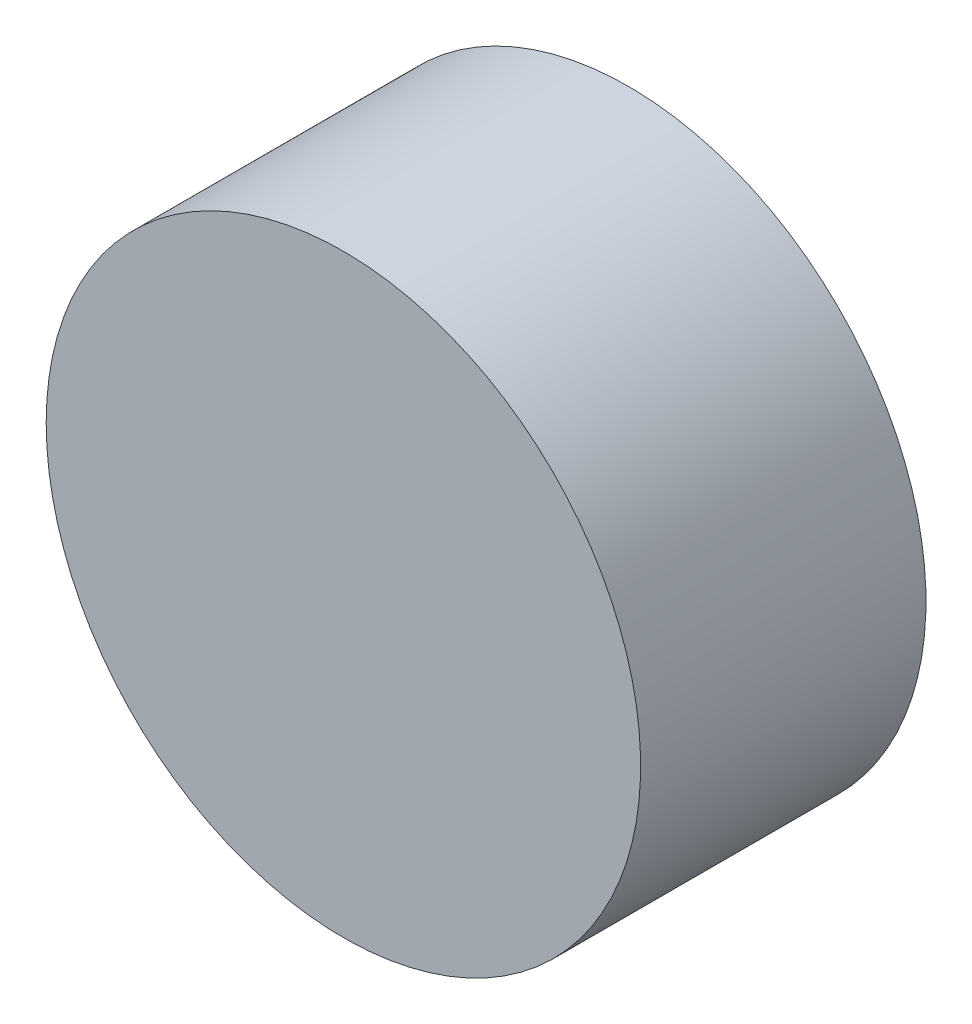
ISO-10303-21;
HEADER;
FILE_DESCRIPTION(('STEP AP214'),'2;1');
FILE_NAME('part.step','',(''),(''),'','','');
FILE_SCHEMA(('AUTOMOTIVE_DESIGN { 1 0 10303 214 1 1 1 1 }'));
ENDSEC;
DATA;
#1=APPLICATION_CONTEXT('core data for automotive mechanical design processes');
#2=APPLICATION_PROTOCOL_DEFINITION('international standard','automotive_design',2000,#1);
#3=PRODUCT_CONTEXT('',#1,'mechanical');
#4=PRODUCT('Part','Part','',(#3));
#5=PRODUCT_RELATED_PRODUCT_CATEGORY('part','',(#4));
#6=PRODUCT_DEFINITION_FORMATION('','',#4);
#7=PRODUCT_DEFINITION_CONTEXT('part definition',#1,'design');
#8=PRODUCT_DEFINITION('design','',#6,#7);
#9=PRODUCT_DEFINITION_SHAPE('','',#8);
#10=(LENGTH_UNIT() NAMED_UNIT(*) SI_UNIT(.MILLI.,.METRE.));
#11=(NAMED_UNIT(*) PLANE_ANGLE_UNIT() SI_UNIT($,.RADIAN.));
#12=(NAMED_UNIT(*) SI_UNIT($,.STERADIAN.) SOLID_ANGLE_UNIT());
#13=UNCERTAINTY_MEASURE_WITH_UNIT(LENGTH_MEASURE(1.E-05),#10,'distance_accuracy_value','');
#14=(GEOMETRIC_REPRESENTATION_CONTEXT(3) GLOBAL_UNCERTAINTY_ASSIGNED_CONTEXT((#13)) GLOBAL_UNIT_ASSIGNED_CONTEXT((#10,
#11,#12)) REPRESENTATION_CONTEXT('',''));
#15=CARTESIAN_POINT('',(0.,0.,0.));
#16=DIRECTION('',(0.,0.,1.));
#17=DIRECTION('',(1.,0.,0.));
#18=AXIS2_PLACEMENT_3D('',#15,#16,#17);
#19=CARTESIAN_POINT('',(0.,0.,1.524));
#20=DIRECTION('',(0.,0.,-1.));
#21=DIRECTION('',(-1.,0.,0.));
#22=AXIS2_PLACEMENT_3D('',#19,#20,#21);
#23=CYLINDRICAL_SURFACE('',#22,1.5875);
#24=CARTESIAN_POINT('',(0.,0.,1.524));
#25=DIRECTION('',(0.,0.,1.));
#26=DIRECTION('',(1.,0.,0.));
#27=AXIS2_PLACEMENT_3D('',#24,#25,#26);
#28=CIRCLE('',#27,1.5875);
#29=CARTESIAN_POINT('',(-1.5875,0.,1.524));
#30=VERTEX_POINT('',#29);
#31=EDGE_CURVE('E10',#30,#30,#28,.T.);
#32=CARTESIAN_POINT('',(0.,0.,0.));
#33=DIRECTION('',(0.,0.,1.));
#34=DIRECTION('',(1.,0.,0.));
#35=AXIS2_PLACEMENT_3D('',#32,#33,#34);
#36=CIRCLE('',#35,1.5875);
#37=CARTESIAN_POINT('',(-1.5875,0.,0.));
#38=VERTEX_POINT('',#37);
#39=EDGE_CURVE('E34',#38,#38,#36,.T.);
#40=CARTESIAN_POINT('',(-1.5875,0.,1.524));
#41=CARTESIAN_POINT('',(-1.5875,0.,1.508125));
#42=CARTESIAN_POINT('',(-1.5875,0.,1.49225));
#43=CARTESIAN_POINT('',(-1.5875,0.,1.4605));
#44=CARTESIAN_POINT('',(-1.5875,0.,1.444625));
#45=CARTESIAN_POINT('',(-1.5875,0.,1.412875));
#46=CARTESIAN_POINT('',(-1.5875,0.,1.397));
#47=CARTESIAN_POINT('',(-1.5875,0.,1.36525));
#48=CARTESIAN_POINT('',(-1.5875,0.,1.349375));
#49=CARTESIAN_POINT('',(-1.5875,0.,1.317625));
#50=CARTESIAN_POINT('',(-1.5875,0.,1.30175));
#51=CARTESIAN_POINT('',(-1.5875,0.,1.27));
#52=CARTESIAN_POINT('',(-1.5875,0.,1.254125));
#53=CARTESIAN_POINT('',(-1.5875,0.,1.222375));
#54=CARTESIAN_POINT('',(-1.5875,0.,1.2065));
#55=CARTESIAN_POINT('',(-1.5875,0.,1.17475));
#56=CARTESIAN_POINT('',(-1.5875,0.,1.158875));
#57=CARTESIAN_POINT('',(-1.5875,0.,1.127125));
#58=CARTESIAN_POINT('',(-1.5875,0.,1.11125));
#59=CARTESIAN_POINT('',(-1.5875,0.,1.0795));
#60=CARTESIAN_POINT('',(-1.5875,0.,1.063625));
#61=CARTESIAN_POINT('',(-1.5875,0.,1.031875));
#62=CARTESIAN_POINT('',(-1.5875,0.,1.016));
#63=CARTESIAN_POINT('',(-1.5875,0.,0.98425));
#64=CARTESIAN_POINT('',(-1.5875,0.,0.968375));
#65=CARTESIAN_POINT('',(-1.5875,0.,0.936625));
#66=CARTESIAN_POINT('',(-1.5875,0.,0.92075));
#67=CARTESIAN_POINT('',(-1.5875,0.,0.889));
#68=CARTESIAN_POINT('',(-1.5875,0.,0.873125));
#69=CARTESIAN_POINT('',(-1.5875,0.,0.841375));
#70=CARTESIAN_POINT('',(-1.5875,0.,0.8255));
#71=CARTESIAN_POINT('',(-1.5875,0.,0.79375));
#72=CARTESIAN_POINT('',(-1.5875,0.,0.777875));
#73=CARTESIAN_POINT('',(-1.5875,0.,0.746125));
#74=CARTESIAN_POINT('',(-1.5875,0.,0.73025));
#75=CARTESIAN_POINT('',(-1.5875,0.,0.6985));
#76=CARTESIAN_POINT('',(-1.5875,0.,0.682625));
#77=CARTESIAN_POINT('',(-1.5875,0.,0.650875));
#78=CARTESIAN_POINT('',(-1.5875,0.,0.635));
#79=CARTESIAN_POINT('',(-1.5875,0.,0.60325));
#80=CARTESIAN_POINT('',(-1.5875,0.,0.587375));
#81=CARTESIAN_POINT('',(-1.5875,0.,0.555625));
#82=CARTESIAN_POINT('',(-1.5875,0.,0.53975));
#83=CARTESIAN_POINT('',(-1.5875,0.,0.508));
#84=CARTESIAN_POINT('',(-1.5875,0.,0.492125));
#85=CARTESIAN_POINT('',(-1.5875,0.,0.460375));
#86=CARTESIAN_POINT('',(-1.5875,0.,0.4445));
#87=CARTESIAN_POINT('',(-1.5875,0.,0.41275));
#88=CARTESIAN_POINT('',(-1.5875,0.,0.396875));
#89=CARTESIAN_POINT('',(-1.5875,0.,0.365125));
#90=CARTESIAN_POINT('',(-1.5875,0.,0.34925));
#91=CARTESIAN_POINT('',(-1.5875,0.,0.3175));
#92=CARTESIAN_POINT('',(-1.5875,0.,0.301625));
#93=CARTESIAN_POINT('',(-1.5875,0.,0.269875));
#94=CARTESIAN_POINT('',(-1.5875,0.,0.254));
#95=CARTESIAN_POINT('',(-1.5875,0.,0.22225));
#96=CARTESIAN_POINT('',(-1.5875,0.,0.206375));
#97=CARTESIAN_POINT('',(-1.5875,0.,0.174625));
#98=CARTESIAN_POINT('',(-1.5875,0.,0.15875));
#99=CARTESIAN_POINT('',(-1.5875,0.,0.127));
#100=CARTESIAN_POINT('',(-1.5875,0.,0.111125));
#101=CARTESIAN_POINT('',(-1.5875,0.,0.079375));
#102=CARTESIAN_POINT('',(-1.5875,0.,0.0635));
#103=CARTESIAN_POINT('',(-1.5875,0.,0.0317499999999999));
#104=CARTESIAN_POINT('',(-1.5875,0.,0.015875));
#105=CARTESIAN_POINT('',(-1.5875,0.,0.));
#106=B_SPLINE_CURVE_WITH_KNOTS('',3,(#40,#41,#42,#43,#44,#45,#46,#47,#48,#49,#50,#51,#52,#53,
#54,#55,#56,#57,#58,#59,#60,#61,#62,#63,#64,#65,#66,#67,#68,#69,#70,#71,#72,#73,#74,#75,#76,#77,
#78,#79,#80,#81,#82,#83,#84,#85,#86,#87,#88,#89,#90,#91,#92,#93,#94,#95,#96,#97,#98,#99,#100,
#101,#102,#103,#104,#105),.UNSPECIFIED.,.F.,.F.,(4,2,2,2,2,2,2,2,2,2,2,2,2,2,2,2,2,2,2,2,2,2,2,
2,2,2,2,2,2,2,2,2,4),(0.,0.0476250000000001,0.0952500000000001,0.142875,0.1905,0.238125,0.28575,
0.333375,0.381,0.428625,0.47625,0.523875,0.5715,0.619125,0.66675,0.714375,0.762,0.809625,
0.85725,0.904875,0.9525,1.000125,1.04775,1.095375,1.143,1.190625,1.23825,1.285875,1.3335,
1.381125,1.42875,1.476375,1.524),.UNSPECIFIED.);
#107=EDGE_CURVE('BSEAM31',#30,#38,#106,.T.);
#108=ORIENTED_EDGE('',*,*,#31,.F.);
#109=ORIENTED_EDGE('',*,*,#39,.T.);
#110=ORIENTED_EDGE('',*,*,#107,.T.);
#111=ORIENTED_EDGE('',*,*,#107,.F.);
#112=EDGE_LOOP('',(#108,#110,#109,#111));
#113=FACE_BOUND('',#112,.T.);
#114=ADVANCED_FACE('F31',(#113),#23,.T.);
#115=CARTESIAN_POINT('',(0.,0.,1.524));
#116=DIRECTION('',(0.,0.,1.));
#117=DIRECTION('',(1.,0.,0.));
#118=AXIS2_PLACEMENT_3D('',#115,#116,#117);
#119=PLANE('',#118);
#120=ORIENTED_EDGE('',*,*,#31,.T.);
#121=EDGE_LOOP('',(#120));
#122=FACE_BOUND('',#121,.T.);
#123=ADVANCED_FACE('F46',(#122),#119,.T.);
#124=CARTESIAN_POINT('',(0.,0.,0.));
#125=DIRECTION('',(0.,0.,1.));
#126=DIRECTION('',(1.,0.,0.));
#127=AXIS2_PLACEMENT_3D('',#124,#125,#126);
#128=PLANE('',#127);
#129=ORIENTED_EDGE('',*,*,#39,.F.);
#130=EDGE_LOOP('',(#129));
#131=FACE_BOUND('',#130,.T.);
#132=ADVANCED_FACE('F44',(#131),#128,.F.);
#133=CLOSED_SHELL('',(#114,#123,#132));
#134=MANIFOLD_SOLID_BREP('B2',#133);
#135=ADVANCED_BREP_SHAPE_REPRESENTATION('',(#18,#134),#14);
#136=SHAPE_DEFINITION_REPRESENTATION(#9,#135);
ENDSEC;
END-ISO-10303-21;
